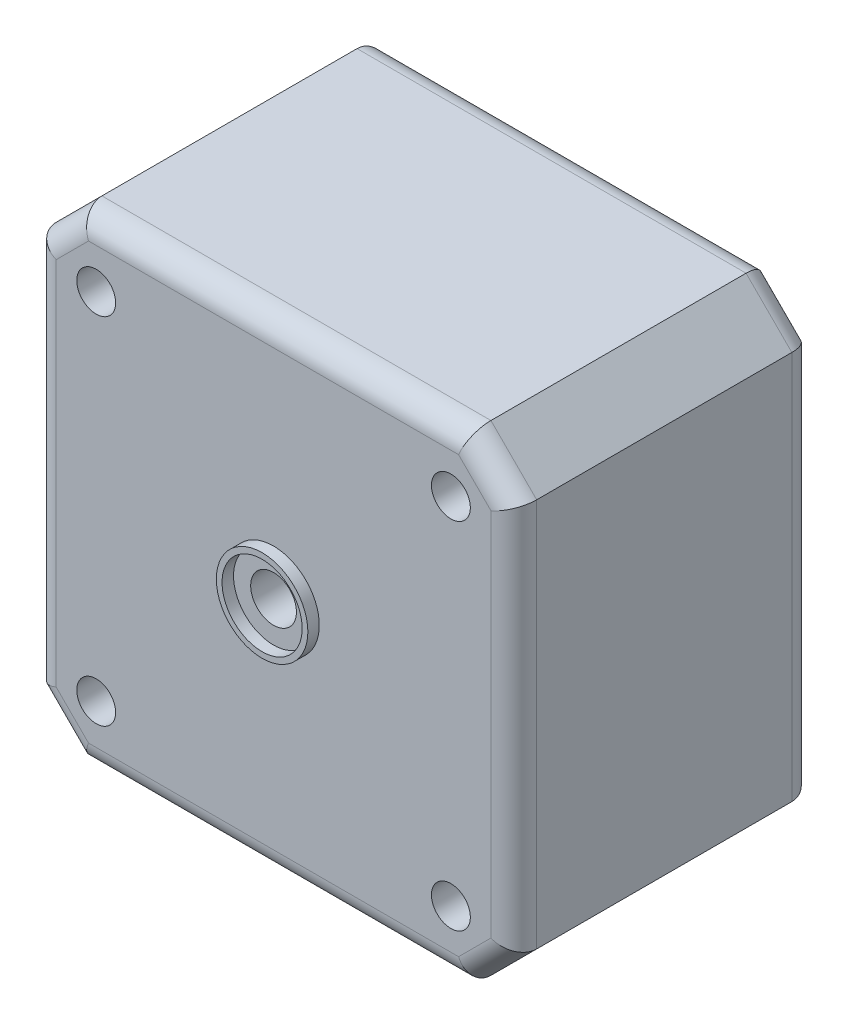
ISO-10303-21;
HEADER;
FILE_DESCRIPTION(('STEP AP214'),'2;1');
FILE_NAME('part.step','',(''),(''),'','','');
FILE_SCHEMA(('AUTOMOTIVE_DESIGN { 1 0 10303 214 1 1 1 1 }'));
ENDSEC;
DATA;
#1=APPLICATION_CONTEXT('core data for automotive mechanical design processes');
#2=APPLICATION_PROTOCOL_DEFINITION('international standard','automotive_design',2000,#1);
#3=PRODUCT_CONTEXT('',#1,'mechanical');
#4=PRODUCT('Part','Part','',(#3));
#5=PRODUCT_RELATED_PRODUCT_CATEGORY('part','',(#4));
#6=PRODUCT_DEFINITION_FORMATION('','',#4);
#7=PRODUCT_DEFINITION_CONTEXT('part definition',#1,'design');
#8=PRODUCT_DEFINITION('design','',#6,#7);
#9=PRODUCT_DEFINITION_SHAPE('','',#8);
#10=(LENGTH_UNIT() NAMED_UNIT(*) SI_UNIT(.MILLI.,.METRE.));
#11=(NAMED_UNIT(*) PLANE_ANGLE_UNIT() SI_UNIT($,.RADIAN.));
#12=(NAMED_UNIT(*) SI_UNIT($,.STERADIAN.) SOLID_ANGLE_UNIT());
#13=UNCERTAINTY_MEASURE_WITH_UNIT(LENGTH_MEASURE(1.E-05),#10,'distance_accuracy_value','');
#14=(GEOMETRIC_REPRESENTATION_CONTEXT(3) GLOBAL_UNCERTAINTY_ASSIGNED_CONTEXT((#13)) GLOBAL_UNIT_ASSIGNED_CONTEXT((#10,
#11,#12)) REPRESENTATION_CONTEXT('',''));
#15=CARTESIAN_POINT('',(0.,0.,0.));
#16=DIRECTION('',(0.,0.,1.));
#17=DIRECTION('',(1.,0.,0.));
#18=AXIS2_PLACEMENT_3D('',#15,#16,#17);
#19=CARTESIAN_POINT('',(0.,0.,26.3));
#20=DIRECTION('',(0.,0.,-1.));
#21=DIRECTION('',(-1.,0.,0.));
#22=AXIS2_PLACEMENT_3D('',#19,#20,#21);
#23=PLANE('',#22);
#24=CARTESIAN_POINT('',(15.5,-15.5,26.3));
#25=DIRECTION('',(0.,0.,1.));
#26=DIRECTION('',(1.,0.,0.));
#27=AXIS2_PLACEMENT_3D('',#24,#25,#26);
#28=CIRCLE('',#27,1.69999999999999);
#29=CARTESIAN_POINT('',(17.2,-15.5,26.3));
#30=VERTEX_POINT('',#29);
#31=EDGE_CURVE('E288',#30,#30,#28,.T.);
#32=ORIENTED_EDGE('',*,*,#31,.F.);
#33=EDGE_LOOP('',(#32));
#34=FACE_BOUND('',#33,.T.);
#35=CARTESIAN_POINT('',(15.5,15.5,26.3));
#36=DIRECTION('',(0.,0.,1.));
#37=DIRECTION('',(1.,0.,0.));
#38=AXIS2_PLACEMENT_3D('',#35,#36,#37);
#39=CIRCLE('',#38,1.69999999999999);
#40=CARTESIAN_POINT('',(17.2,15.5,26.3));
#41=VERTEX_POINT('',#40);
#42=EDGE_CURVE('E277',#41,#41,#39,.T.);
#43=ORIENTED_EDGE('',*,*,#42,.F.);
#44=EDGE_LOOP('',(#43));
#45=FACE_BOUND('',#44,.T.);
#46=CARTESIAN_POINT('',(-15.5,-15.5,26.3));
#47=DIRECTION('',(0.,0.,1.));
#48=DIRECTION('',(1.,0.,0.));
#49=AXIS2_PLACEMENT_3D('',#46,#47,#48);
#50=CIRCLE('',#49,1.69999999999999);
#51=CARTESIAN_POINT('',(-13.8,-15.5,26.3));
#52=VERTEX_POINT('',#51);
#53=EDGE_CURVE('E276',#52,#52,#50,.T.);
#54=ORIENTED_EDGE('',*,*,#53,.F.);
#55=EDGE_LOOP('',(#54));
#56=FACE_BOUND('',#55,.T.);
#57=CARTESIAN_POINT('',(-15.5,15.5,26.3));
#58=DIRECTION('',(0.,0.,1.));
#59=DIRECTION('',(1.,0.,0.));
#60=AXIS2_PLACEMENT_3D('',#57,#58,#59);
#61=CIRCLE('',#60,1.69999999999999);
#62=CARTESIAN_POINT('',(-13.8,15.5,26.3));
#63=VERTEX_POINT('',#62);
#64=EDGE_CURVE('E273',#63,#63,#61,.T.);
#65=ORIENTED_EDGE('',*,*,#64,.F.);
#66=EDGE_LOOP('',(#65));
#67=FACE_BOUND('',#66,.T.);
#68=DIRECTION('',(-1.,0.,0.));
#69=VECTOR('',#68,1.);
#70=CARTESIAN_POINT('',(0.,19.,26.3));
#71=LINE('',#70,#69);
#72=CARTESIAN_POINT('',(16.1715728752538,19.,26.3));
#73=VERTEX_POINT('',#72);
#74=CARTESIAN_POINT('',(-16.1715728752538,19.,26.3));
#75=VERTEX_POINT('',#74);
#76=EDGE_CURVE('E175',#73,#75,#71,.T.);
#77=ORIENTED_EDGE('',*,*,#76,.T.);
#78=DIRECTION('',(0.707106781186549,0.707106781186546,0.));
#79=VECTOR('',#78,1.);
#80=CARTESIAN_POINT('',(-19.5857864376269,15.5857864376269,26.3));
#81=LINE('',#80,#79);
#82=CARTESIAN_POINT('',(-19.,16.1715728752538,26.3));
#83=VERTEX_POINT('',#82);
#84=EDGE_CURVE('E155',#75,#83,#81,.F.);
#85=ORIENTED_EDGE('',*,*,#84,.T.);
#86=DIRECTION('',(0.,-1.,0.));
#87=VECTOR('',#86,1.);
#88=CARTESIAN_POINT('',(-19.,0.,26.3));
#89=LINE('',#88,#87);
#90=CARTESIAN_POINT('',(-19.,-16.1715728752538,26.3));
#91=VERTEX_POINT('',#90);
#92=EDGE_CURVE('E164',#83,#91,#89,.T.);
#93=ORIENTED_EDGE('',*,*,#92,.T.);
#94=DIRECTION('',(-0.707106781186546,0.707106781186549,0.));
#95=VECTOR('',#94,1.);
#96=CARTESIAN_POINT('',(-15.5857864376269,-19.5857864376269,26.3));
#97=LINE('',#96,#95);
#98=CARTESIAN_POINT('',(-16.1715728752538,-19.,26.3));
#99=VERTEX_POINT('',#98);
#100=EDGE_CURVE('E170',#91,#99,#97,.F.);
#101=ORIENTED_EDGE('',*,*,#100,.T.);
#102=DIRECTION('',(1.,0.,0.));
#103=VECTOR('',#102,1.);
#104=CARTESIAN_POINT('',(0.,-19.,26.3));
#105=LINE('',#104,#103);
#106=CARTESIAN_POINT('',(16.1715728752538,-19.,26.3));
#107=VERTEX_POINT('',#106);
#108=EDGE_CURVE('E340',#99,#107,#105,.T.);
#109=ORIENTED_EDGE('',*,*,#108,.T.);
#110=DIRECTION('',(-0.707106781186549,-0.707106781186546,0.));
#111=VECTOR('',#110,1.);
#112=CARTESIAN_POINT('',(19.5857864376269,-15.5857864376269,26.3));
#113=LINE('',#112,#111);
#114=CARTESIAN_POINT('',(19.,-16.1715728752538,26.3));
#115=VERTEX_POINT('',#114);
#116=EDGE_CURVE('E342',#107,#115,#113,.F.);
#117=ORIENTED_EDGE('',*,*,#116,.T.);
#118=DIRECTION('',(0.,1.,0.));
#119=VECTOR('',#118,1.);
#120=CARTESIAN_POINT('',(19.,0.,26.3));
#121=LINE('',#120,#119);
#122=CARTESIAN_POINT('',(19.,16.1715728752538,26.3));
#123=VERTEX_POINT('',#122);
#124=EDGE_CURVE('E344',#115,#123,#121,.T.);
#125=ORIENTED_EDGE('',*,*,#124,.T.);
#126=DIRECTION('',(0.707106781186546,-0.707106781186549,0.));
#127=VECTOR('',#126,1.);
#128=CARTESIAN_POINT('',(15.5857864376269,19.5857864376269,26.3));
#129=LINE('',#128,#127);
#130=EDGE_CURVE('E180',#123,#73,#129,.F.);
#131=ORIENTED_EDGE('',*,*,#130,.T.);
#132=EDGE_LOOP('',(#77,#85,#93,#101,#109,#117,#125,#131));
#133=FACE_BOUND('',#132,.T.);
#134=CARTESIAN_POINT('',(0.,0.,26.3));
#135=DIRECTION('',(0.,0.,-1.));
#136=DIRECTION('',(-1.,0.,0.));
#137=AXIS2_PLACEMENT_3D('',#134,#135,#136);
#138=CIRCLE('',#137,4.);
#139=CARTESIAN_POINT('',(-4.,0.,26.3));
#140=VERTEX_POINT('',#139);
#141=EDGE_CURVE('E11',#140,#140,#138,.F.);
#142=ORIENTED_EDGE('',*,*,#141,.F.);
#143=EDGE_LOOP('',(#142));
#144=FACE_BOUND('',#143,.T.);
#145=ADVANCED_FACE('F35',(#34,#45,#56,#67,#133,#144),#23,.F.);
#146=CARTESIAN_POINT('',(0.,0.,0.));
#147=DIRECTION('',(0.,0.,-1.));
#148=DIRECTION('',(-1.,0.,0.));
#149=AXIS2_PLACEMENT_3D('',#146,#147,#148);
#150=PLANE('',#149);
#151=CARTESIAN_POINT('',(15.5,-15.5,0.));
#152=DIRECTION('',(0.,0.,-1.));
#153=DIRECTION('',(-1.,0.,0.));
#154=AXIS2_PLACEMENT_3D('',#151,#152,#153);
#155=CIRCLE('',#154,1.69999999999999);
#156=CARTESIAN_POINT('',(13.8,-15.5,0.));
#157=VERTEX_POINT('',#156);
#158=EDGE_CURVE('E39',#157,#157,#155,.T.);
#159=ORIENTED_EDGE('',*,*,#158,.F.);
#160=EDGE_LOOP('',(#159));
#161=FACE_BOUND('',#160,.T.);
#162=CARTESIAN_POINT('',(15.5,15.5,0.));
#163=DIRECTION('',(0.,0.,-1.));
#164=DIRECTION('',(-1.,0.,0.));
#165=AXIS2_PLACEMENT_3D('',#162,#163,#164);
#166=CIRCLE('',#165,1.69999999999999);
#167=CARTESIAN_POINT('',(13.8,15.5,0.));
#168=VERTEX_POINT('',#167);
#169=EDGE_CURVE('E274',#168,#168,#166,.T.);
#170=ORIENTED_EDGE('',*,*,#169,.F.);
#171=EDGE_LOOP('',(#170));
#172=FACE_BOUND('',#171,.T.);
#173=CARTESIAN_POINT('',(-15.5,-15.5,0.));
#174=DIRECTION('',(0.,0.,-1.));
#175=DIRECTION('',(-1.,0.,0.));
#176=AXIS2_PLACEMENT_3D('',#173,#174,#175);
#177=CIRCLE('',#176,1.69999999999999);
#178=CARTESIAN_POINT('',(-17.2,-15.5,0.));
#179=VERTEX_POINT('',#178);
#180=EDGE_CURVE('E281',#179,#179,#177,.T.);
#181=ORIENTED_EDGE('',*,*,#180,.F.);
#182=EDGE_LOOP('',(#181));
#183=FACE_BOUND('',#182,.T.);
#184=CARTESIAN_POINT('',(-15.5,15.5,0.));
#185=DIRECTION('',(0.,0.,-1.));
#186=DIRECTION('',(-1.,0.,0.));
#187=AXIS2_PLACEMENT_3D('',#184,#185,#186);
#188=CIRCLE('',#187,1.69999999999999);
#189=CARTESIAN_POINT('',(-17.2,15.5,0.));
#190=VERTEX_POINT('',#189);
#191=EDGE_CURVE('E270',#190,#190,#188,.T.);
#192=ORIENTED_EDGE('',*,*,#191,.F.);
#193=EDGE_LOOP('',(#192));
#194=FACE_BOUND('',#193,.T.);
#195=DIRECTION('',(0.,1.,0.));
#196=VECTOR('',#195,1.);
#197=CARTESIAN_POINT('',(19.,-17.,0.));
#198=LINE('',#197,#196);
#199=CARTESIAN_POINT('',(19.,16.1715728752538,0.));
#200=VERTEX_POINT('',#199);
#201=CARTESIAN_POINT('',(19.,-16.1715728752538,0.));
#202=VERTEX_POINT('',#201);
#203=EDGE_CURVE('E52',#200,#202,#198,.F.);
#204=ORIENTED_EDGE('',*,*,#203,.T.);
#205=DIRECTION('',(0.707106781186549,0.707106781186546,0.));
#206=VECTOR('',#205,1.);
#207=CARTESIAN_POINT('',(17.5857864376269,-17.5857864376269,0.));
#208=LINE('',#207,#206);
#209=CARTESIAN_POINT('',(16.1715728752538,-19.,0.));
#210=VERTEX_POINT('',#209);
#211=EDGE_CURVE('E226',#202,#210,#208,.F.);
#212=ORIENTED_EDGE('',*,*,#211,.T.);
#213=DIRECTION('',(1.,0.,0.));
#214=VECTOR('',#213,1.);
#215=CARTESIAN_POINT('',(-17.,-19.,0.));
#216=LINE('',#215,#214);
#217=CARTESIAN_POINT('',(-16.1715728752538,-19.,0.));
#218=VERTEX_POINT('',#217);
#219=EDGE_CURVE('E214',#210,#218,#216,.F.);
#220=ORIENTED_EDGE('',*,*,#219,.T.);
#221=DIRECTION('',(0.707106781186546,-0.707106781186549,0.));
#222=VECTOR('',#221,1.);
#223=CARTESIAN_POINT('',(-17.585786437627,-17.5857864376269,0.));
#224=LINE('',#223,#222);
#225=CARTESIAN_POINT('',(-19.,-16.1715728752538,0.));
#226=VERTEX_POINT('',#225);
#227=EDGE_CURVE('E216',#218,#226,#224,.F.);
#228=ORIENTED_EDGE('',*,*,#227,.T.);
#229=DIRECTION('',(0.,-1.,0.));
#230=VECTOR('',#229,1.);
#231=CARTESIAN_POINT('',(-19.,17.,0.));
#232=LINE('',#231,#230);
#233=CARTESIAN_POINT('',(-19.,16.1715728752538,0.));
#234=VERTEX_POINT('',#233);
#235=EDGE_CURVE('E218',#226,#234,#232,.F.);
#236=ORIENTED_EDGE('',*,*,#235,.T.);
#237=DIRECTION('',(-0.707106781186549,-0.707106781186546,0.));
#238=VECTOR('',#237,1.);
#239=CARTESIAN_POINT('',(-17.5857864376269,17.5857864376269,0.));
#240=LINE('',#239,#238);
#241=CARTESIAN_POINT('',(-16.1715728752538,19.,0.));
#242=VERTEX_POINT('',#241);
#243=EDGE_CURVE('E220',#234,#242,#240,.F.);
#244=ORIENTED_EDGE('',*,*,#243,.T.);
#245=DIRECTION('',(-1.,0.,0.));
#246=VECTOR('',#245,1.);
#247=CARTESIAN_POINT('',(17.,19.,0.));
#248=LINE('',#247,#246);
#249=CARTESIAN_POINT('',(16.1715728752538,19.,0.));
#250=VERTEX_POINT('',#249);
#251=EDGE_CURVE('E222',#242,#250,#248,.F.);
#252=ORIENTED_EDGE('',*,*,#251,.T.);
#253=DIRECTION('',(-0.707106781186546,0.707106781186549,0.));
#254=VECTOR('',#253,1.);
#255=CARTESIAN_POINT('',(17.5857864376269,17.5857864376269,0.));
#256=LINE('',#255,#254);
#257=EDGE_CURVE('E57',#250,#200,#256,.F.);
#258=ORIENTED_EDGE('',*,*,#257,.T.);
#259=EDGE_LOOP('',(#204,#212,#220,#228,#236,#244,#252,#258));
#260=FACE_BOUND('',#259,.T.);
#261=CARTESIAN_POINT('',(0.,0.,0.));
#262=DIRECTION('',(0.,0.,-1.));
#263=DIRECTION('',(-1.,0.,0.));
#264=AXIS2_PLACEMENT_3D('',#261,#262,#263);
#265=CIRCLE('',#264,4.);
#266=CARTESIAN_POINT('',(-4.,0.,0.));
#267=VERTEX_POINT('',#266);
#268=EDGE_CURVE('E306',#267,#267,#265,.T.);
#269=ORIENTED_EDGE('',*,*,#268,.F.);
#270=EDGE_LOOP('',(#269));
#271=FACE_BOUND('',#270,.T.);
#272=ADVANCED_FACE('F381',(#161,#172,#183,#194,#260,#271),#150,.T.);
#273=CARTESIAN_POINT('',(21.,-21.,26.3));
#274=DIRECTION('',(-1.,0.,0.));
#275=DIRECTION('',(0.,0.,1.));
#276=AXIS2_PLACEMENT_3D('',#273,#274,#275);
#277=PLANE('',#276);
#278=DIRECTION('',(0.,0.,1.));
#279=VECTOR('',#278,1.);
#280=CARTESIAN_POINT('',(21.,17.,26.3));
#281=LINE('',#280,#279);
#282=CARTESIAN_POINT('',(21.,17.,2.));
#283=VERTEX_POINT('',#282);
#284=CARTESIAN_POINT('',(21.,17.,24.3));
#285=VERTEX_POINT('',#284);
#286=EDGE_CURVE('E328',#283,#285,#281,.T.);
#287=ORIENTED_EDGE('',*,*,#286,.T.);
#288=DIRECTION('',(0.,1.,0.));
#289=VECTOR('',#288,1.);
#290=CARTESIAN_POINT('',(21.,-21.,24.3));
#291=LINE('',#290,#289);
#292=CARTESIAN_POINT('',(21.,-17.,24.3));
#293=VERTEX_POINT('',#292);
#294=EDGE_CURVE('E195',#285,#293,#291,.F.);
#295=ORIENTED_EDGE('',*,*,#294,.T.);
#296=DIRECTION('',(0.,0.,-1.));
#297=VECTOR('',#296,1.);
#298=CARTESIAN_POINT('',(21.,-17.,26.3));
#299=LINE('',#298,#297);
#300=CARTESIAN_POINT('',(21.,-17.,2.));
#301=VERTEX_POINT('',#300);
#302=EDGE_CURVE('E331',#293,#301,#299,.T.);
#303=ORIENTED_EDGE('',*,*,#302,.T.);
#304=DIRECTION('',(0.,1.,0.));
#305=VECTOR('',#304,1.);
#306=CARTESIAN_POINT('',(21.,17.,2.));
#307=LINE('',#306,#305);
#308=EDGE_CURVE('E193',#301,#283,#307,.T.);
#309=ORIENTED_EDGE('',*,*,#308,.T.);
#310=EDGE_LOOP('',(#287,#295,#303,#309));
#311=FACE_BOUND('',#310,.T.);
#312=ADVANCED_FACE('F411',(#311),#277,.F.);
#313=CARTESIAN_POINT('',(-21.,21.,26.3));
#314=DIRECTION('',(0.,-1.,0.));
#315=DIRECTION('',(0.,0.,-1.));
#316=AXIS2_PLACEMENT_3D('',#313,#314,#315);
#317=PLANE('',#316);
#318=DIRECTION('',(0.,0.,1.));
#319=VECTOR('',#318,1.);
#320=CARTESIAN_POINT('',(-17.,21.,26.3));
#321=LINE('',#320,#319);
#322=CARTESIAN_POINT('',(-17.,21.,2.));
#323=VERTEX_POINT('',#322);
#324=CARTESIAN_POINT('',(-17.,21.,24.3));
#325=VERTEX_POINT('',#324);
#326=EDGE_CURVE('E334',#323,#325,#321,.T.);
#327=ORIENTED_EDGE('',*,*,#326,.T.);
#328=DIRECTION('',(-1.,0.,0.));
#329=VECTOR('',#328,1.);
#330=CARTESIAN_POINT('',(-21.,21.,24.3));
#331=LINE('',#330,#329);
#332=CARTESIAN_POINT('',(17.,21.,24.3));
#333=VERTEX_POINT('',#332);
#334=EDGE_CURVE('E187',#325,#333,#331,.F.);
#335=ORIENTED_EDGE('',*,*,#334,.T.);
#336=DIRECTION('',(0.,0.,-1.));
#337=VECTOR('',#336,1.);
#338=CARTESIAN_POINT('',(17.,21.,26.3));
#339=LINE('',#338,#337);
#340=CARTESIAN_POINT('',(17.,21.,2.));
#341=VERTEX_POINT('',#340);
#342=EDGE_CURVE('E171',#333,#341,#339,.T.);
#343=ORIENTED_EDGE('',*,*,#342,.T.);
#344=DIRECTION('',(-1.,0.,0.));
#345=VECTOR('',#344,1.);
#346=CARTESIAN_POINT('',(-17.,21.,2.));
#347=LINE('',#346,#345);
#348=EDGE_CURVE('E185',#341,#323,#347,.T.);
#349=ORIENTED_EDGE('',*,*,#348,.T.);
#350=EDGE_LOOP('',(#327,#335,#343,#349));
#351=FACE_BOUND('',#350,.T.);
#352=ADVANCED_FACE('F362',(#351),#317,.F.);
#353=CARTESIAN_POINT('',(-21.,-21.,26.3));
#354=DIRECTION('',(1.,0.,0.));
#355=DIRECTION('',(0.,0.,-1.));
#356=AXIS2_PLACEMENT_3D('',#353,#354,#355);
#357=PLANE('',#356);
#358=DIRECTION('',(0.,0.,1.));
#359=VECTOR('',#358,1.);
#360=CARTESIAN_POINT('',(-21.,-17.,26.3));
#361=LINE('',#360,#359);
#362=CARTESIAN_POINT('',(-21.,-17.,2.));
#363=VERTEX_POINT('',#362);
#364=CARTESIAN_POINT('',(-21.,-17.,24.3));
#365=VERTEX_POINT('',#364);
#366=EDGE_CURVE('E325',#363,#365,#361,.T.);
#367=ORIENTED_EDGE('',*,*,#366,.T.);
#368=DIRECTION('',(0.,-1.,0.));
#369=VECTOR('',#368,1.);
#370=CARTESIAN_POINT('',(-21.,-21.,24.3));
#371=LINE('',#370,#369);
#372=CARTESIAN_POINT('',(-21.,17.,24.3));
#373=VERTEX_POINT('',#372);
#374=EDGE_CURVE('E212',#365,#373,#371,.F.);
#375=ORIENTED_EDGE('',*,*,#374,.T.);
#376=DIRECTION('',(0.,0.,-1.));
#377=VECTOR('',#376,1.);
#378=CARTESIAN_POINT('',(-21.,17.,26.3));
#379=LINE('',#378,#377);
#380=CARTESIAN_POINT('',(-21.,17.,2.));
#381=VERTEX_POINT('',#380);
#382=EDGE_CURVE('E322',#373,#381,#379,.T.);
#383=ORIENTED_EDGE('',*,*,#382,.T.);
#384=DIRECTION('',(0.,-1.,0.));
#385=VECTOR('',#384,1.);
#386=CARTESIAN_POINT('',(-21.,-17.,2.));
#387=LINE('',#386,#385);
#388=EDGE_CURVE('E210',#381,#363,#387,.T.);
#389=ORIENTED_EDGE('',*,*,#388,.T.);
#390=EDGE_LOOP('',(#367,#375,#383,#389));
#391=FACE_BOUND('',#390,.T.);
#392=ADVANCED_FACE('F444',(#391),#357,.F.);
#393=CARTESIAN_POINT('',(-21.,-21.,26.3));
#394=DIRECTION('',(0.,1.,0.));
#395=DIRECTION('',(0.,0.,1.));
#396=AXIS2_PLACEMENT_3D('',#393,#394,#395);
#397=PLANE('',#396);
#398=DIRECTION('',(0.,0.,1.));
#399=VECTOR('',#398,1.);
#400=CARTESIAN_POINT('',(17.,-21.,26.3));
#401=LINE('',#400,#399);
#402=CARTESIAN_POINT('',(17.,-21.,2.));
#403=VERTEX_POINT('',#402);
#404=CARTESIAN_POINT('',(17.,-21.,24.3));
#405=VERTEX_POINT('',#404);
#406=EDGE_CURVE('E245',#403,#405,#401,.T.);
#407=ORIENTED_EDGE('',*,*,#406,.T.);
#408=DIRECTION('',(1.,0.,0.));
#409=VECTOR('',#408,1.);
#410=CARTESIAN_POINT('',(-21.,-21.,24.3));
#411=LINE('',#410,#409);
#412=CARTESIAN_POINT('',(-17.,-21.,24.3));
#413=VERTEX_POINT('',#412);
#414=EDGE_CURVE('E204',#405,#413,#411,.F.);
#415=ORIENTED_EDGE('',*,*,#414,.T.);
#416=DIRECTION('',(0.,0.,-1.));
#417=VECTOR('',#416,1.);
#418=CARTESIAN_POINT('',(-17.,-21.,26.3));
#419=LINE('',#418,#417);
#420=CARTESIAN_POINT('',(-17.,-21.,2.));
#421=VERTEX_POINT('',#420);
#422=EDGE_CURVE('E319',#413,#421,#419,.T.);
#423=ORIENTED_EDGE('',*,*,#422,.T.);
#424=DIRECTION('',(1.,0.,0.));
#425=VECTOR('',#424,1.);
#426=CARTESIAN_POINT('',(17.,-21.,2.));
#427=LINE('',#426,#425);
#428=EDGE_CURVE('E202',#421,#403,#427,.T.);
#429=ORIENTED_EDGE('',*,*,#428,.T.);
#430=EDGE_LOOP('',(#407,#415,#423,#429));
#431=FACE_BOUND('',#430,.T.);
#432=ADVANCED_FACE('F395',(#431),#397,.F.);
#433=CARTESIAN_POINT('',(0.,0.,26.3));
#434=DIRECTION('',(0.,0.,1.));
#435=DIRECTION('',(1.,0.,0.));
#436=AXIS2_PLACEMENT_3D('',#433,#434,#435);
#437=CIRCLE('',#436,3.5);
#438=CARTESIAN_POINT('',(3.5,0.,26.3));
#439=VERTEX_POINT('',#438);
#440=EDGE_CURVE('E272',#439,#439,#437,.T.);
#441=ORIENTED_EDGE('',*,*,#440,.T.);
#442=EDGE_LOOP('',(#441));
#443=FACE_BOUND('',#442,.T.);
#444=CARTESIAN_POINT('',(0.,0.,26.3));
#445=DIRECTION('',(0.,0.,-1.));
#446=DIRECTION('',(-1.,0.,0.));
#447=AXIS2_PLACEMENT_3D('',#444,#445,#446);
#448=CIRCLE('',#447,2.);
#449=CARTESIAN_POINT('',(-2.,0.,26.3));
#450=VERTEX_POINT('',#449);
#451=EDGE_CURVE('E249',#450,#450,#448,.T.);
#452=ORIENTED_EDGE('',*,*,#451,.T.);
#453=EDGE_LOOP('',(#452));
#454=FACE_BOUND('',#453,.T.);
#455=ADVANCED_FACE('F427',(#443,#454),#23,.F.);
#456=CARTESIAN_POINT('',(0.,0.,0.));
#457=DIRECTION('',(0.,0.,-1.));
#458=DIRECTION('',(-1.,0.,0.));
#459=AXIS2_PLACEMENT_3D('',#456,#457,#458);
#460=CIRCLE('',#459,3.5);
#461=CARTESIAN_POINT('',(-3.5,0.,0.));
#462=VERTEX_POINT('',#461);
#463=EDGE_CURVE('E44',#462,#462,#460,.F.);
#464=ORIENTED_EDGE('',*,*,#463,.F.);
#465=EDGE_LOOP('',(#464));
#466=FACE_BOUND('',#465,.T.);
#467=CARTESIAN_POINT('',(0.,0.,0.));
#468=DIRECTION('',(0.,0.,-1.));
#469=DIRECTION('',(-1.,0.,0.));
#470=AXIS2_PLACEMENT_3D('',#467,#468,#469);
#471=CIRCLE('',#470,2.);
#472=CARTESIAN_POINT('',(-2.,0.,0.));
#473=VERTEX_POINT('',#472);
#474=EDGE_CURVE('E310',#473,#473,#471,.T.);
#475=ORIENTED_EDGE('',*,*,#474,.F.);
#476=EDGE_LOOP('',(#475));
#477=FACE_BOUND('',#476,.T.);
#478=ADVANCED_FACE('F433',(#466,#477),#150,.T.);
#479=CARTESIAN_POINT('',(-17.,-21.,26.3));
#480=DIRECTION('',(0.707106781186549,0.707106781186546,0.));
#481=DIRECTION('',(0.,0.,-1.));
#482=AXIS2_PLACEMENT_3D('',#479,#480,#481);
#483=PLANE('',#482);
#484=ORIENTED_EDGE('',*,*,#422,.F.);
#485=DIRECTION('',(0.707106781186546,-0.707106781186549,0.));
#486=VECTOR('',#485,1.);
#487=CARTESIAN_POINT('',(-21.,-17.,24.3));
#488=LINE('',#487,#486);
#489=EDGE_CURVE('E208',#413,#365,#488,.F.);
#490=ORIENTED_EDGE('',*,*,#489,.T.);
#491=ORIENTED_EDGE('',*,*,#366,.F.);
#492=DIRECTION('',(-0.707106781186546,0.707106781186549,0.));
#493=VECTOR('',#492,1.);
#494=CARTESIAN_POINT('',(-17.,-21.,2.));
#495=LINE('',#494,#493);
#496=EDGE_CURVE('E206',#363,#421,#495,.F.);
#497=ORIENTED_EDGE('',*,*,#496,.T.);
#498=EDGE_LOOP('',(#484,#490,#491,#497));
#499=FACE_BOUND('',#498,.T.);
#500=ADVANCED_FACE('F422',(#499),#483,.F.);
#501=CARTESIAN_POINT('',(21.,-17.,26.3));
#502=DIRECTION('',(-0.707106781186546,0.707106781186549,0.));
#503=DIRECTION('',(0.,0.,-1.));
#504=AXIS2_PLACEMENT_3D('',#501,#502,#503);
#505=PLANE('',#504);
#506=ORIENTED_EDGE('',*,*,#302,.F.);
#507=DIRECTION('',(0.707106781186549,0.707106781186546,0.));
#508=VECTOR('',#507,1.);
#509=CARTESIAN_POINT('',(17.,-21.,24.3));
#510=LINE('',#509,#508);
#511=EDGE_CURVE('E200',#293,#405,#510,.F.);
#512=ORIENTED_EDGE('',*,*,#511,.T.);
#513=ORIENTED_EDGE('',*,*,#406,.F.);
#514=DIRECTION('',(-0.707106781186549,-0.707106781186546,0.));
#515=VECTOR('',#514,1.);
#516=CARTESIAN_POINT('',(21.,-17.,2.));
#517=LINE('',#516,#515);
#518=EDGE_CURVE('E197',#403,#301,#517,.F.);
#519=ORIENTED_EDGE('',*,*,#518,.T.);
#520=EDGE_LOOP('',(#506,#512,#513,#519));
#521=FACE_BOUND('',#520,.T.);
#522=ADVANCED_FACE('F400',(#521),#505,.F.);
#523=CARTESIAN_POINT('',(17.,21.,26.3));
#524=DIRECTION('',(-0.707106781186549,-0.707106781186546,0.));
#525=DIRECTION('',(0.,0.,-1.));
#526=AXIS2_PLACEMENT_3D('',#523,#524,#525);
#527=PLANE('',#526);
#528=ORIENTED_EDGE('',*,*,#342,.F.);
#529=DIRECTION('',(-0.707106781186546,0.707106781186549,0.));
#530=VECTOR('',#529,1.);
#531=CARTESIAN_POINT('',(21.,17.,24.3));
#532=LINE('',#531,#530);
#533=EDGE_CURVE('E191',#333,#285,#532,.F.);
#534=ORIENTED_EDGE('',*,*,#533,.T.);
#535=ORIENTED_EDGE('',*,*,#286,.F.);
#536=DIRECTION('',(0.707106781186546,-0.707106781186549,0.));
#537=VECTOR('',#536,1.);
#538=CARTESIAN_POINT('',(17.,21.,2.));
#539=LINE('',#538,#537);
#540=EDGE_CURVE('E189',#283,#341,#539,.F.);
#541=ORIENTED_EDGE('',*,*,#540,.T.);
#542=EDGE_LOOP('',(#528,#534,#535,#541));
#543=FACE_BOUND('',#542,.T.);
#544=ADVANCED_FACE('F414',(#543),#527,.F.);
#545=CARTESIAN_POINT('',(-21.,17.,26.3));
#546=DIRECTION('',(0.707106781186546,-0.707106781186549,0.));
#547=DIRECTION('',(0.,0.,-1.));
#548=AXIS2_PLACEMENT_3D('',#545,#546,#547);
#549=PLANE('',#548);
#550=ORIENTED_EDGE('',*,*,#382,.F.);
#551=DIRECTION('',(-0.707106781186549,-0.707106781186546,0.));
#552=VECTOR('',#551,1.);
#553=CARTESIAN_POINT('',(-17.,21.,24.3));
#554=LINE('',#553,#552);
#555=EDGE_CURVE('E157',#373,#325,#554,.F.);
#556=ORIENTED_EDGE('',*,*,#555,.T.);
#557=ORIENTED_EDGE('',*,*,#326,.F.);
#558=DIRECTION('',(0.707106781186549,0.707106781186546,0.));
#559=VECTOR('',#558,1.);
#560=CARTESIAN_POINT('',(-21.,17.,2.));
#561=LINE('',#560,#559);
#562=EDGE_CURVE('E177',#323,#381,#561,.F.);
#563=ORIENTED_EDGE('',*,*,#562,.T.);
#564=EDGE_LOOP('',(#550,#556,#557,#563));
#565=FACE_BOUND('',#564,.T.);
#566=ADVANCED_FACE('F360',(#565),#549,.F.);
#567=CARTESIAN_POINT('',(17.5857864376269,-17.5857864376269,24.3));
#568=DIRECTION('',(0.707106781186549,0.707106781186546,0.));
#569=DIRECTION('',(-0.707106781186546,0.707106781186549,0.));
#570=AXIS2_PLACEMENT_3D('',#567,#568,#569);
#571=CYLINDRICAL_SURFACE('',#570,2.);
#572=CARTESIAN_POINT('',(16.1715728752538,-19.,24.3));
#573=DIRECTION('',(0.923879532511287,0.382683432365089,0.));
#574=DIRECTION('',(0.382683432365089,-0.923879532511287,0.));
#575=AXIS2_PLACEMENT_3D('',#572,#573,#574);
#576=ELLIPSE('',#575,2.16478440058479,2.);
#577=EDGE_CURVE('E239',#405,#107,#576,.F.);
#578=ORIENTED_EDGE('',*,*,#577,.F.);
#579=ORIENTED_EDGE('',*,*,#511,.F.);
#580=CARTESIAN_POINT('',(19.,-16.1715728752538,24.3));
#581=DIRECTION('',(0.382683432365091,0.923879532511286,0.));
#582=DIRECTION('',(0.923879532511286,-0.382683432365091,0.));
#583=AXIS2_PLACEMENT_3D('',#580,#581,#582);
#584=ELLIPSE('',#583,2.16478440058479,2.);
#585=EDGE_CURVE('E242',#115,#293,#584,.T.);
#586=ORIENTED_EDGE('',*,*,#585,.F.);
#587=ORIENTED_EDGE('',*,*,#116,.F.);
#588=EDGE_LOOP('',(#578,#579,#586,#587));
#589=FACE_BOUND('',#588,.T.);
#590=ADVANCED_FACE('F404',(#589),#571,.T.);
#591=CARTESIAN_POINT('',(19.,0.,24.3));
#592=DIRECTION('',(0.,1.,0.));
#593=DIRECTION('',(0.,0.,1.));
#594=AXIS2_PLACEMENT_3D('',#591,#592,#593);
#595=CYLINDRICAL_SURFACE('',#594,2.);
#596=ORIENTED_EDGE('',*,*,#585,.T.);
#597=ORIENTED_EDGE('',*,*,#294,.F.);
#598=CARTESIAN_POINT('',(19.,16.1715728752538,24.3));
#599=DIRECTION('',(-0.382683432365089,0.923879532511287,0.));
#600=DIRECTION('',(0.923879532511287,0.382683432365089,0.));
#601=AXIS2_PLACEMENT_3D('',#598,#599,#600);
#602=ELLIPSE('',#601,2.16478440058479,2.);
#603=EDGE_CURVE('E236',#123,#285,#602,.T.);
#604=ORIENTED_EDGE('',*,*,#603,.F.);
#605=ORIENTED_EDGE('',*,*,#124,.F.);
#606=EDGE_LOOP('',(#596,#597,#604,#605));
#607=FACE_BOUND('',#606,.T.);
#608=ADVANCED_FACE('F409',(#607),#595,.T.);
#609=CARTESIAN_POINT('',(0.,-19.,24.3));
#610=DIRECTION('',(1.,0.,0.));
#611=DIRECTION('',(0.,0.,-1.));
#612=AXIS2_PLACEMENT_3D('',#609,#610,#611);
#613=CYLINDRICAL_SURFACE('',#612,2.);
#614=ORIENTED_EDGE('',*,*,#577,.T.);
#615=ORIENTED_EDGE('',*,*,#108,.F.);
#616=CARTESIAN_POINT('',(-16.1715728752538,-19.,24.3));
#617=DIRECTION('',(0.923879532511286,-0.382683432365091,0.));
#618=DIRECTION('',(-0.382683432365091,-0.923879532511286,0.));
#619=AXIS2_PLACEMENT_3D('',#616,#617,#618);
#620=ELLIPSE('',#619,2.16478440058479,2.);
#621=EDGE_CURVE('E233',#413,#99,#620,.F.);
#622=ORIENTED_EDGE('',*,*,#621,.F.);
#623=ORIENTED_EDGE('',*,*,#414,.F.);
#624=EDGE_LOOP('',(#614,#615,#622,#623));
#625=FACE_BOUND('',#624,.T.);
#626=ADVANCED_FACE('F671',(#625),#613,.T.);
#627=CARTESIAN_POINT('',(17.5857864376269,17.5857864376269,24.3));
#628=DIRECTION('',(-0.707106781186546,0.707106781186549,0.));
#629=DIRECTION('',(-0.707106781186549,-0.707106781186546,0.));
#630=AXIS2_PLACEMENT_3D('',#627,#628,#629);
#631=CYLINDRICAL_SURFACE('',#630,2.);
#632=ORIENTED_EDGE('',*,*,#603,.T.);
#633=ORIENTED_EDGE('',*,*,#533,.F.);
#634=CARTESIAN_POINT('',(16.1715728752538,19.,24.3));
#635=DIRECTION('',(-0.923879532511286,0.382683432365091,0.));
#636=DIRECTION('',(0.382683432365091,0.923879532511286,0.));
#637=AXIS2_PLACEMENT_3D('',#634,#635,#636);
#638=ELLIPSE('',#637,2.16478440058479,2.);
#639=EDGE_CURVE('E230',#73,#333,#638,.T.);
#640=ORIENTED_EDGE('',*,*,#639,.F.);
#641=ORIENTED_EDGE('',*,*,#130,.F.);
#642=EDGE_LOOP('',(#632,#633,#640,#641));
#643=FACE_BOUND('',#642,.T.);
#644=ADVANCED_FACE('F351',(#643),#631,.T.);
#645=CARTESIAN_POINT('',(-17.585786437627,-17.5857864376269,24.3));
#646=DIRECTION('',(0.707106781186546,-0.707106781186549,0.));
#647=DIRECTION('',(0.707106781186549,0.707106781186546,0.));
#648=AXIS2_PLACEMENT_3D('',#645,#646,#647);
#649=CYLINDRICAL_SURFACE('',#648,2.);
#650=ORIENTED_EDGE('',*,*,#621,.T.);
#651=ORIENTED_EDGE('',*,*,#100,.F.);
#652=CARTESIAN_POINT('',(-19.,-16.1715728752538,24.3));
#653=DIRECTION('',(0.382683432365089,-0.923879532511287,0.));
#654=DIRECTION('',(-0.923879532511287,-0.382683432365089,0.));
#655=AXIS2_PLACEMENT_3D('',#652,#653,#654);
#656=ELLIPSE('',#655,2.16478440058479,2.);
#657=EDGE_CURVE('E167',#365,#91,#656,.F.);
#658=ORIENTED_EDGE('',*,*,#657,.F.);
#659=ORIENTED_EDGE('',*,*,#489,.F.);
#660=EDGE_LOOP('',(#650,#651,#658,#659));
#661=FACE_BOUND('',#660,.T.);
#662=ADVANCED_FACE('F653',(#661),#649,.T.);
#663=CARTESIAN_POINT('',(0.,19.,24.3));
#664=DIRECTION('',(-1.,0.,0.));
#665=DIRECTION('',(0.,0.,1.));
#666=AXIS2_PLACEMENT_3D('',#663,#664,#665);
#667=CYLINDRICAL_SURFACE('',#666,2.);
#668=ORIENTED_EDGE('',*,*,#639,.T.);
#669=ORIENTED_EDGE('',*,*,#334,.F.);
#670=CARTESIAN_POINT('',(-16.1715728752538,19.,24.3));
#671=DIRECTION('',(-0.923879532511287,-0.382683432365089,0.));
#672=DIRECTION('',(-0.382683432365089,0.923879532511287,0.));
#673=AXIS2_PLACEMENT_3D('',#670,#671,#672);
#674=ELLIPSE('',#673,2.16478440058479,2.);
#675=EDGE_CURVE('E160',#75,#325,#674,.T.);
#676=ORIENTED_EDGE('',*,*,#675,.F.);
#677=ORIENTED_EDGE('',*,*,#76,.F.);
#678=EDGE_LOOP('',(#668,#669,#676,#677));
#679=FACE_BOUND('',#678,.T.);
#680=ADVANCED_FACE('F354',(#679),#667,.T.);
#681=CARTESIAN_POINT('',(-19.,0.,24.3));
#682=DIRECTION('',(0.,-1.,0.));
#683=DIRECTION('',(0.,0.,-1.));
#684=AXIS2_PLACEMENT_3D('',#681,#682,#683);
#685=CYLINDRICAL_SURFACE('',#684,2.);
#686=ORIENTED_EDGE('',*,*,#657,.T.);
#687=ORIENTED_EDGE('',*,*,#92,.F.);
#688=CARTESIAN_POINT('',(-19.,16.1715728752538,24.3));
#689=DIRECTION('',(-0.382683432365091,-0.923879532511286,0.));
#690=DIRECTION('',(0.923879532511286,-0.382683432365091,0.));
#691=AXIS2_PLACEMENT_3D('',#688,#689,#690);
#692=ELLIPSE('',#691,2.16478440058479,2.);
#693=EDGE_CURVE('E151',#373,#83,#692,.F.);
#694=ORIENTED_EDGE('',*,*,#693,.F.);
#695=ORIENTED_EDGE('',*,*,#374,.F.);
#696=EDGE_LOOP('',(#686,#687,#694,#695));
#697=FACE_BOUND('',#696,.T.);
#698=ADVANCED_FACE('F165',(#697),#685,.T.);
#699=CARTESIAN_POINT('',(-17.5857864376269,17.5857864376269,24.3));
#700=DIRECTION('',(-0.707106781186549,-0.707106781186546,0.));
#701=DIRECTION('',(0.707106781186546,-0.707106781186549,0.));
#702=AXIS2_PLACEMENT_3D('',#699,#700,#701);
#703=CYLINDRICAL_SURFACE('',#702,2.);
#704=ORIENTED_EDGE('',*,*,#675,.T.);
#705=ORIENTED_EDGE('',*,*,#555,.F.);
#706=ORIENTED_EDGE('',*,*,#693,.T.);
#707=ORIENTED_EDGE('',*,*,#84,.F.);
#708=EDGE_LOOP('',(#704,#705,#706,#707));
#709=FACE_BOUND('',#708,.T.);
#710=ADVANCED_FACE('F153',(#709),#703,.T.);
#711=CARTESIAN_POINT('',(-17.5857864376269,17.5857864376269,2.));
#712=DIRECTION('',(-0.707106781186549,-0.707106781186546,0.));
#713=DIRECTION('',(0.707106781186546,-0.707106781186549,0.));
#714=AXIS2_PLACEMENT_3D('',#711,#712,#713);
#715=CYLINDRICAL_SURFACE('',#714,2.);
#716=CARTESIAN_POINT('',(-19.,16.1715728752538,2.));
#717=DIRECTION('',(0.382683432365091,0.923879532511286,0.));
#718=DIRECTION('',(-0.923879532511286,0.382683432365091,0.));
#719=AXIS2_PLACEMENT_3D('',#716,#717,#718);
#720=ELLIPSE('',#719,2.16478440058479,2.);
#721=EDGE_CURVE('E263',#381,#234,#720,.F.);
#722=ORIENTED_EDGE('',*,*,#721,.F.);
#723=ORIENTED_EDGE('',*,*,#562,.F.);
#724=CARTESIAN_POINT('',(-16.1715728752538,19.,2.));
#725=DIRECTION('',(-0.923879532511287,-0.382683432365089,0.));
#726=DIRECTION('',(0.382683432365089,-0.923879532511287,0.));
#727=AXIS2_PLACEMENT_3D('',#724,#725,#726);
#728=ELLIPSE('',#727,2.16478440058479,2.);
#729=EDGE_CURVE('E161',#242,#323,#728,.F.);
#730=ORIENTED_EDGE('',*,*,#729,.F.);
#731=ORIENTED_EDGE('',*,*,#243,.F.);
#732=EDGE_LOOP('',(#722,#723,#730,#731));
#733=FACE_BOUND('',#732,.T.);
#734=ADVANCED_FACE('F37',(#733),#715,.T.);
#735=CARTESIAN_POINT('',(-21.,19.,2.));
#736=DIRECTION('',(1.,0.,0.));
#737=DIRECTION('',(0.,0.,-1.));
#738=AXIS2_PLACEMENT_3D('',#735,#736,#737);
#739=CYLINDRICAL_SURFACE('',#738,2.);
#740=ORIENTED_EDGE('',*,*,#729,.T.);
#741=ORIENTED_EDGE('',*,*,#348,.F.);
#742=CARTESIAN_POINT('',(16.1715728752538,19.,2.));
#743=DIRECTION('',(0.923879532511286,-0.382683432365091,0.));
#744=DIRECTION('',(0.382683432365091,0.923879532511286,0.));
#745=AXIS2_PLACEMENT_3D('',#742,#743,#744);
#746=ELLIPSE('',#745,2.16478440058479,2.);
#747=EDGE_CURVE('E260',#250,#341,#746,.T.);
#748=ORIENTED_EDGE('',*,*,#747,.F.);
#749=ORIENTED_EDGE('',*,*,#251,.F.);
#750=EDGE_LOOP('',(#740,#741,#748,#749));
#751=FACE_BOUND('',#750,.T.);
#752=ADVANCED_FACE('F366',(#751),#739,.T.);
#753=CARTESIAN_POINT('',(-19.,-21.,2.));
#754=DIRECTION('',(0.,1.,0.));
#755=DIRECTION('',(0.,0.,1.));
#756=AXIS2_PLACEMENT_3D('',#753,#754,#755);
#757=CYLINDRICAL_SURFACE('',#756,2.);
#758=ORIENTED_EDGE('',*,*,#721,.T.);
#759=ORIENTED_EDGE('',*,*,#235,.F.);
#760=CARTESIAN_POINT('',(-19.,-16.1715728752538,2.));
#761=DIRECTION('',(0.382683432365089,-0.923879532511287,0.));
#762=DIRECTION('',(0.923879532511287,0.382683432365089,0.));
#763=AXIS2_PLACEMENT_3D('',#760,#761,#762);
#764=ELLIPSE('',#763,2.16478440058479,2.);
#765=EDGE_CURVE('E257',#363,#226,#764,.T.);
#766=ORIENTED_EDGE('',*,*,#765,.F.);
#767=ORIENTED_EDGE('',*,*,#388,.F.);
#768=EDGE_LOOP('',(#758,#759,#766,#767));
#769=FACE_BOUND('',#768,.T.);
#770=ADVANCED_FACE('F604',(#769),#757,.T.);
#771=CARTESIAN_POINT('',(17.5857864376269,17.5857864376269,2.));
#772=DIRECTION('',(-0.707106781186546,0.707106781186549,0.));
#773=DIRECTION('',(-0.707106781186549,-0.707106781186546,0.));
#774=AXIS2_PLACEMENT_3D('',#771,#772,#773);
#775=CYLINDRICAL_SURFACE('',#774,2.);
#776=ORIENTED_EDGE('',*,*,#747,.T.);
#777=ORIENTED_EDGE('',*,*,#540,.F.);
#778=CARTESIAN_POINT('',(19.,16.1715728752538,2.));
#779=DIRECTION('',(-0.382683432365089,0.923879532511287,0.));
#780=DIRECTION('',(-0.923879532511287,-0.382683432365089,0.));
#781=AXIS2_PLACEMENT_3D('',#778,#779,#780);
#782=ELLIPSE('',#781,2.16478440058479,2.);
#783=EDGE_CURVE('E254',#200,#283,#782,.F.);
#784=ORIENTED_EDGE('',*,*,#783,.F.);
#785=ORIENTED_EDGE('',*,*,#257,.F.);
#786=EDGE_LOOP('',(#776,#777,#784,#785));
#787=FACE_BOUND('',#786,.T.);
#788=ADVANCED_FACE('F371',(#787),#775,.T.);
#789=CARTESIAN_POINT('',(-17.585786437627,-17.5857864376269,2.));
#790=DIRECTION('',(0.707106781186546,-0.707106781186549,0.));
#791=DIRECTION('',(0.707106781186549,0.707106781186546,0.));
#792=AXIS2_PLACEMENT_3D('',#789,#790,#791);
#793=CYLINDRICAL_SURFACE('',#792,2.);
#794=ORIENTED_EDGE('',*,*,#765,.T.);
#795=ORIENTED_EDGE('',*,*,#227,.F.);
#796=CARTESIAN_POINT('',(-16.1715728752538,-19.,2.));
#797=DIRECTION('',(-0.923879532511286,0.382683432365091,0.));
#798=DIRECTION('',(-0.382683432365091,-0.923879532511286,0.));
#799=AXIS2_PLACEMENT_3D('',#796,#797,#798);
#800=ELLIPSE('',#799,2.16478440058479,2.);
#801=EDGE_CURVE('E251',#421,#218,#800,.F.);
#802=ORIENTED_EDGE('',*,*,#801,.F.);
#803=ORIENTED_EDGE('',*,*,#496,.F.);
#804=EDGE_LOOP('',(#794,#795,#802,#803));
#805=FACE_BOUND('',#804,.T.);
#806=ADVANCED_FACE('F388',(#805),#793,.T.);
#807=CARTESIAN_POINT('',(19.,-21.,2.));
#808=DIRECTION('',(0.,-1.,0.));
#809=DIRECTION('',(0.,0.,-1.));
#810=AXIS2_PLACEMENT_3D('',#807,#808,#809);
#811=CYLINDRICAL_SURFACE('',#810,2.);
#812=ORIENTED_EDGE('',*,*,#783,.T.);
#813=ORIENTED_EDGE('',*,*,#308,.F.);
#814=CARTESIAN_POINT('',(19.,-16.1715728752538,2.));
#815=DIRECTION('',(-0.382683432365091,-0.923879532511286,0.));
#816=DIRECTION('',(0.923879532511286,-0.382683432365091,0.));
#817=AXIS2_PLACEMENT_3D('',#814,#815,#816);
#818=ELLIPSE('',#817,2.16478440058479,2.);
#819=EDGE_CURVE('E248',#202,#301,#818,.T.);
#820=ORIENTED_EDGE('',*,*,#819,.F.);
#821=ORIENTED_EDGE('',*,*,#203,.F.);
#822=EDGE_LOOP('',(#812,#813,#820,#821));
#823=FACE_BOUND('',#822,.T.);
#824=ADVANCED_FACE('F374',(#823),#811,.T.);
#825=CARTESIAN_POINT('',(-21.,-19.,2.));
#826=DIRECTION('',(-1.,0.,0.));
#827=DIRECTION('',(0.,0.,1.));
#828=AXIS2_PLACEMENT_3D('',#825,#826,#827);
#829=CYLINDRICAL_SURFACE('',#828,2.);
#830=ORIENTED_EDGE('',*,*,#801,.T.);
#831=ORIENTED_EDGE('',*,*,#219,.F.);
#832=CARTESIAN_POINT('',(16.1715728752538,-19.,2.));
#833=DIRECTION('',(-0.923879532511287,-0.382683432365089,0.));
#834=DIRECTION('',(-0.382683432365089,0.923879532511287,0.));
#835=AXIS2_PLACEMENT_3D('',#832,#833,#834);
#836=ELLIPSE('',#835,2.16478440058479,2.);
#837=EDGE_CURVE('E246',#403,#210,#836,.F.);
#838=ORIENTED_EDGE('',*,*,#837,.F.);
#839=ORIENTED_EDGE('',*,*,#428,.F.);
#840=EDGE_LOOP('',(#830,#831,#838,#839));
#841=FACE_BOUND('',#840,.T.);
#842=ADVANCED_FACE('F392',(#841),#829,.T.);
#843=CARTESIAN_POINT('',(17.5857864376269,-17.5857864376269,2.));
#844=DIRECTION('',(0.707106781186549,0.707106781186546,0.));
#845=DIRECTION('',(-0.707106781186546,0.707106781186549,0.));
#846=AXIS2_PLACEMENT_3D('',#843,#844,#845);
#847=CYLINDRICAL_SURFACE('',#846,2.);
#848=ORIENTED_EDGE('',*,*,#819,.T.);
#849=ORIENTED_EDGE('',*,*,#518,.F.);
#850=ORIENTED_EDGE('',*,*,#837,.T.);
#851=ORIENTED_EDGE('',*,*,#211,.F.);
#852=EDGE_LOOP('',(#848,#849,#850,#851));
#853=FACE_BOUND('',#852,.T.);
#854=ADVANCED_FACE('F378',(#853),#847,.T.);
#855=CARTESIAN_POINT('',(0.,0.,26.3));
#856=DIRECTION('',(0.,0.,-1.));
#857=DIRECTION('',(-1.,0.,0.));
#858=AXIS2_PLACEMENT_3D('',#855,#856,#857);
#859=CYLINDRICAL_SURFACE('',#858,2.);
#860=ORIENTED_EDGE('',*,*,#451,.F.);
#861=EDGE_LOOP('',(#860));
#862=FACE_BOUND('',#861,.T.);
#863=ORIENTED_EDGE('',*,*,#474,.T.);
#864=EDGE_LOOP('',(#863));
#865=FACE_BOUND('',#864,.T.);
#866=ADVANCED_FACE('F450',(#862,#865),#859,.F.);
#867=CARTESIAN_POINT('',(0.,0.,-1.));
#868=DIRECTION('',(0.,0.,-1.));
#869=DIRECTION('',(-1.,0.,0.));
#870=AXIS2_PLACEMENT_3D('',#867,#868,#869);
#871=PLANE('',#870);
#872=CARTESIAN_POINT('',(0.,0.,-1.));
#873=DIRECTION('',(0.,0.,-1.));
#874=DIRECTION('',(-1.,0.,0.));
#875=AXIS2_PLACEMENT_3D('',#872,#873,#874);
#876=CIRCLE('',#875,4.);
#877=CARTESIAN_POINT('',(-4.,0.,-1.));
#878=VERTEX_POINT('',#877);
#879=EDGE_CURVE('E307',#878,#878,#876,.T.);
#880=ORIENTED_EDGE('',*,*,#879,.T.);
#881=EDGE_LOOP('',(#880));
#882=FACE_BOUND('',#881,.T.);
#883=CARTESIAN_POINT('',(0.,0.,-1.));
#884=DIRECTION('',(0.,0.,-1.));
#885=DIRECTION('',(-1.,0.,0.));
#886=AXIS2_PLACEMENT_3D('',#883,#884,#885);
#887=CIRCLE('',#886,3.5);
#888=CARTESIAN_POINT('',(-3.5,0.,-1.));
#889=VERTEX_POINT('',#888);
#890=EDGE_CURVE('E303',#889,#889,#887,.T.);
#891=ORIENTED_EDGE('',*,*,#890,.F.);
#892=EDGE_LOOP('',(#891));
#893=FACE_BOUND('',#892,.T.);
#894=ADVANCED_FACE('F453',(#882,#893),#871,.T.);
#895=CARTESIAN_POINT('',(0.,0.,-1.));
#896=DIRECTION('',(0.,0.,1.));
#897=DIRECTION('',(1.,0.,0.));
#898=AXIS2_PLACEMENT_3D('',#895,#896,#897);
#899=CYLINDRICAL_SURFACE('',#898,4.);
#900=ORIENTED_EDGE('',*,*,#879,.F.);
#901=EDGE_LOOP('',(#900));
#902=FACE_BOUND('',#901,.T.);
#903=ORIENTED_EDGE('',*,*,#268,.T.);
#904=EDGE_LOOP('',(#903));
#905=FACE_BOUND('',#904,.T.);
#906=ADVANCED_FACE('F460',(#902,#905),#899,.T.);
#907=CARTESIAN_POINT('',(0.,0.,-1.));
#908=DIRECTION('',(0.,0.,1.));
#909=DIRECTION('',(1.,0.,0.));
#910=AXIS2_PLACEMENT_3D('',#907,#908,#909);
#911=CYLINDRICAL_SURFACE('',#910,3.5);
#912=ORIENTED_EDGE('',*,*,#890,.T.);
#913=EDGE_LOOP('',(#912));
#914=FACE_BOUND('',#913,.T.);
#915=ORIENTED_EDGE('',*,*,#463,.T.);
#916=EDGE_LOOP('',(#915));
#917=FACE_BOUND('',#916,.T.);
#918=ADVANCED_FACE('F466',(#914,#917),#911,.F.);
#919=CARTESIAN_POINT('',(0.,0.,27.3));
#920=DIRECTION('',(0.,0.,1.));
#921=DIRECTION('',(1.,0.,0.));
#922=AXIS2_PLACEMENT_3D('',#919,#920,#921);
#923=PLANE('',#922);
#924=CARTESIAN_POINT('',(0.,0.,27.3));
#925=DIRECTION('',(0.,0.,1.));
#926=DIRECTION('',(1.,0.,0.));
#927=AXIS2_PLACEMENT_3D('',#924,#925,#926);
#928=CIRCLE('',#927,4.);
#929=CARTESIAN_POINT('',(4.,0.,27.3));
#930=VERTEX_POINT('',#929);
#931=EDGE_CURVE('E298',#930,#930,#928,.T.);
#932=ORIENTED_EDGE('',*,*,#931,.T.);
#933=EDGE_LOOP('',(#932));
#934=FACE_BOUND('',#933,.T.);
#935=CARTESIAN_POINT('',(0.,0.,27.3));
#936=DIRECTION('',(0.,0.,1.));
#937=DIRECTION('',(1.,0.,0.));
#938=AXIS2_PLACEMENT_3D('',#935,#936,#937);
#939=CIRCLE('',#938,3.5);
#940=CARTESIAN_POINT('',(3.5,0.,27.3));
#941=VERTEX_POINT('',#940);
#942=EDGE_CURVE('E295',#941,#941,#939,.T.);
#943=ORIENTED_EDGE('',*,*,#942,.F.);
#944=EDGE_LOOP('',(#943));
#945=FACE_BOUND('',#944,.T.);
#946=ADVANCED_FACE('F471',(#934,#945),#923,.T.);
#947=CARTESIAN_POINT('',(0.,0.,27.3));
#948=DIRECTION('',(0.,0.,-1.));
#949=DIRECTION('',(-1.,0.,0.));
#950=AXIS2_PLACEMENT_3D('',#947,#948,#949);
#951=CYLINDRICAL_SURFACE('',#950,4.);
#952=ORIENTED_EDGE('',*,*,#931,.F.);
#953=EDGE_LOOP('',(#952));
#954=FACE_BOUND('',#953,.T.);
#955=ORIENTED_EDGE('',*,*,#141,.T.);
#956=EDGE_LOOP('',(#955));
#957=FACE_BOUND('',#956,.T.);
#958=ADVANCED_FACE('F473',(#954,#957),#951,.T.);
#959=CARTESIAN_POINT('',(0.,0.,27.3));
#960=DIRECTION('',(0.,0.,-1.));
#961=DIRECTION('',(-1.,0.,0.));
#962=AXIS2_PLACEMENT_3D('',#959,#960,#961);
#963=CYLINDRICAL_SURFACE('',#962,3.5);
#964=ORIENTED_EDGE('',*,*,#942,.T.);
#965=EDGE_LOOP('',(#964));
#966=FACE_BOUND('',#965,.T.);
#967=ORIENTED_EDGE('',*,*,#440,.F.);
#968=EDGE_LOOP('',(#967));
#969=FACE_BOUND('',#968,.T.);
#970=ADVANCED_FACE('F476',(#966,#969),#963,.F.);
#971=CARTESIAN_POINT('',(-15.5,15.5,26.3));
#972=DIRECTION('',(0.,0.,1.));
#973=DIRECTION('',(1.,0.,0.));
#974=AXIS2_PLACEMENT_3D('',#971,#972,#973);
#975=CYLINDRICAL_SURFACE('',#974,1.69999999999999);
#976=ORIENTED_EDGE('',*,*,#191,.T.);
#977=EDGE_LOOP('',(#976));
#978=FACE_BOUND('',#977,.T.);
#979=ORIENTED_EDGE('',*,*,#64,.T.);
#980=EDGE_LOOP('',(#979));
#981=FACE_BOUND('',#980,.T.);
#982=ADVANCED_FACE('F483',(#978,#981),#975,.F.);
#983=CARTESIAN_POINT('',(-15.5,-15.5,26.3));
#984=DIRECTION('',(0.,0.,1.));
#985=DIRECTION('',(1.,0.,0.));
#986=AXIS2_PLACEMENT_3D('',#983,#984,#985);
#987=CYLINDRICAL_SURFACE('',#986,1.69999999999999);
#988=ORIENTED_EDGE('',*,*,#180,.T.);
#989=EDGE_LOOP('',(#988));
#990=FACE_BOUND('',#989,.T.);
#991=ORIENTED_EDGE('',*,*,#53,.T.);
#992=EDGE_LOOP('',(#991));
#993=FACE_BOUND('',#992,.T.);
#994=ADVANCED_FACE('F487',(#990,#993),#987,.F.);
#995=CARTESIAN_POINT('',(15.5,15.5,26.3));
#996=DIRECTION('',(0.,0.,1.));
#997=DIRECTION('',(1.,0.,0.));
#998=AXIS2_PLACEMENT_3D('',#995,#996,#997);
#999=CYLINDRICAL_SURFACE('',#998,1.69999999999999);
#1000=ORIENTED_EDGE('',*,*,#169,.T.);
#1001=EDGE_LOOP('',(#1000));
#1002=FACE_BOUND('',#1001,.T.);
#1003=ORIENTED_EDGE('',*,*,#42,.T.);
#1004=EDGE_LOOP('',(#1003));
#1005=FACE_BOUND('',#1004,.T.);
#1006=ADVANCED_FACE('F491',(#1002,#1005),#999,.F.);
#1007=CARTESIAN_POINT('',(15.5,-15.5,26.3));
#1008=DIRECTION('',(0.,0.,1.));
#1009=DIRECTION('',(1.,0.,0.));
#1010=AXIS2_PLACEMENT_3D('',#1007,#1008,#1009);
#1011=CYLINDRICAL_SURFACE('',#1010,1.69999999999999);
#1012=ORIENTED_EDGE('',*,*,#158,.T.);
#1013=EDGE_LOOP('',(#1012));
#1014=FACE_BOUND('',#1013,.T.);
#1015=ORIENTED_EDGE('',*,*,#31,.T.);
#1016=EDGE_LOOP('',(#1015));
#1017=FACE_BOUND('',#1016,.T.);
#1018=ADVANCED_FACE('F495',(#1014,#1017),#1011,.F.);
#1019=CLOSED_SHELL('',(#145,#272,#312,#352,#392,#432,#455,#478,#500,#522,#544,#566,#590,#608,
#626,#644,#662,#680,#698,#710,#734,#752,#770,#788,#806,#824,#842,#854,#866,#894,#906,#918,#946,
#958,#970,#982,#994,#1006,#1018));
#1020=MANIFOLD_SOLID_BREP('B2',#1019);
#1021=ADVANCED_BREP_SHAPE_REPRESENTATION('',(#18,#1020),#14);
#1022=SHAPE_DEFINITION_REPRESENTATION(#9,#1021);
ENDSEC;
END-ISO-10303-21;
